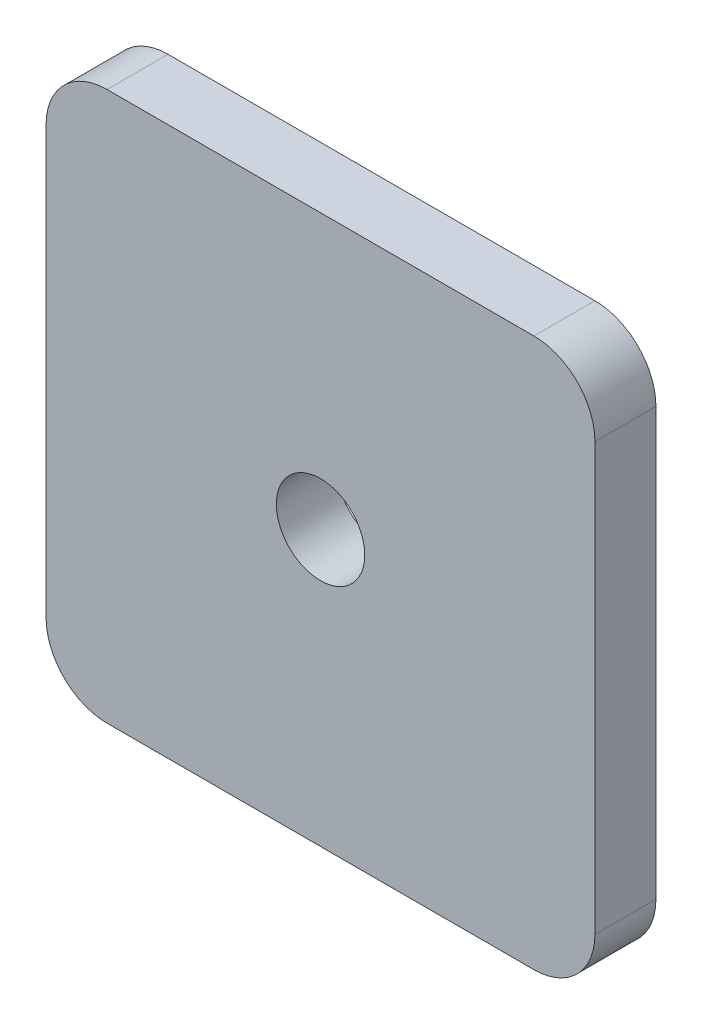
ISO-10303-21;
HEADER;
FILE_DESCRIPTION(('STEP AP214'),'2;1');
FILE_NAME('part.step','',(''),(''),'','','');
FILE_SCHEMA(('AUTOMOTIVE_DESIGN { 1 0 10303 214 1 1 1 1 }'));
ENDSEC;
DATA;
#1=APPLICATION_CONTEXT('core data for automotive mechanical design processes');
#2=APPLICATION_PROTOCOL_DEFINITION('international standard','automotive_design',2000,#1);
#3=PRODUCT_CONTEXT('',#1,'mechanical');
#4=PRODUCT('Part','Part','',(#3));
#5=PRODUCT_RELATED_PRODUCT_CATEGORY('part','',(#4));
#6=PRODUCT_DEFINITION_FORMATION('','',#4);
#7=PRODUCT_DEFINITION_CONTEXT('part definition',#1,'design');
#8=PRODUCT_DEFINITION('design','',#6,#7);
#9=PRODUCT_DEFINITION_SHAPE('','',#8);
#10=(LENGTH_UNIT() NAMED_UNIT(*) SI_UNIT(.MILLI.,.METRE.));
#11=(NAMED_UNIT(*) PLANE_ANGLE_UNIT() SI_UNIT($,.RADIAN.));
#12=(NAMED_UNIT(*) SI_UNIT($,.STERADIAN.) SOLID_ANGLE_UNIT());
#13=UNCERTAINTY_MEASURE_WITH_UNIT(LENGTH_MEASURE(1.E-05),#10,'distance_accuracy_value','');
#14=(GEOMETRIC_REPRESENTATION_CONTEXT(3) GLOBAL_UNCERTAINTY_ASSIGNED_CONTEXT((#13)) GLOBAL_UNIT_ASSIGNED_CONTEXT((#10,
#11,#12)) REPRESENTATION_CONTEXT('',''));
#15=CARTESIAN_POINT('',(0.,0.,0.));
#16=DIRECTION('',(0.,0.,1.));
#17=DIRECTION('',(1.,0.,0.));
#18=AXIS2_PLACEMENT_3D('',#15,#16,#17);
#19=CARTESIAN_POINT('',(45.,45.,-10.));
#20=DIRECTION('',(1.,0.,0.));
#21=DIRECTION('',(0.,1.,0.));
#22=AXIS2_PLACEMENT_3D('',#19,#20,#21);
#23=PLANE('',#22);
#24=DIRECTION('',(0.,1.,0.));
#25=VECTOR('',#24,1.);
#26=CARTESIAN_POINT('',(45.,45.,-10.));
#27=LINE('',#26,#25);
#28=CARTESIAN_POINT('',(45.,-35.,-10.));
#29=VERTEX_POINT('',#28);
#30=CARTESIAN_POINT('',(45.,35.,-10.));
#31=VERTEX_POINT('',#30);
#32=EDGE_CURVE('E200',#29,#31,#27,.T.);
#33=ORIENTED_EDGE('',*,*,#32,.T.);
#34=DIRECTION('',(0.,0.,1.));
#35=VECTOR('',#34,1.);
#36=CARTESIAN_POINT('',(45.,35.,-10.));
#37=LINE('',#36,#35);
#38=CARTESIAN_POINT('',(45.,35.,0.));
#39=VERTEX_POINT('',#38);
#40=EDGE_CURVE('E179',#31,#39,#37,.T.);
#41=ORIENTED_EDGE('',*,*,#40,.T.);
#42=DIRECTION('',(0.,1.,0.));
#43=VECTOR('',#42,1.);
#44=CARTESIAN_POINT('',(45.,45.,0.));
#45=LINE('',#44,#43);
#46=CARTESIAN_POINT('',(45.,-35.,0.));
#47=VERTEX_POINT('',#46);
#48=EDGE_CURVE('E116',#47,#39,#45,.T.);
#49=ORIENTED_EDGE('',*,*,#48,.F.);
#50=DIRECTION('',(0.,0.,1.));
#51=VECTOR('',#50,1.);
#52=CARTESIAN_POINT('',(45.,-35.,-10.));
#53=LINE('',#52,#51);
#54=EDGE_CURVE('E176',#47,#29,#53,.F.);
#55=ORIENTED_EDGE('',*,*,#54,.T.);
#56=EDGE_LOOP('',(#33,#41,#49,#55));
#57=FACE_BOUND('',#56,.T.);
#58=ADVANCED_FACE('F44',(#57),#23,.T.);
#59=CARTESIAN_POINT('',(-45.,-45.,-10.));
#60=DIRECTION('',(0.,-1.,0.));
#61=DIRECTION('',(0.,0.,-1.));
#62=AXIS2_PLACEMENT_3D('',#59,#60,#61);
#63=PLANE('',#62);
#64=DIRECTION('',(1.,0.,0.));
#65=VECTOR('',#64,1.);
#66=CARTESIAN_POINT('',(-45.,-45.,-10.));
#67=LINE('',#66,#65);
#68=CARTESIAN_POINT('',(-35.,-45.,-10.));
#69=VERTEX_POINT('',#68);
#70=CARTESIAN_POINT('',(35.,-45.,-10.));
#71=VERTEX_POINT('',#70);
#72=EDGE_CURVE('E140',#69,#71,#67,.T.);
#73=ORIENTED_EDGE('',*,*,#72,.T.);
#74=DIRECTION('',(0.,0.,1.));
#75=VECTOR('',#74,1.);
#76=CARTESIAN_POINT('',(35.,-45.,-10.));
#77=LINE('',#76,#75);
#78=CARTESIAN_POINT('',(35.,-45.,0.));
#79=VERTEX_POINT('',#78);
#80=EDGE_CURVE('E11',#71,#79,#77,.T.);
#81=ORIENTED_EDGE('',*,*,#80,.T.);
#82=DIRECTION('',(1.,0.,0.));
#83=VECTOR('',#82,1.);
#84=CARTESIAN_POINT('',(-45.,-45.,0.));
#85=LINE('',#84,#83);
#86=CARTESIAN_POINT('',(-35.,-45.,0.));
#87=VERTEX_POINT('',#86);
#88=EDGE_CURVE('E150',#87,#79,#85,.T.);
#89=ORIENTED_EDGE('',*,*,#88,.F.);
#90=DIRECTION('',(0.,0.,1.));
#91=VECTOR('',#90,1.);
#92=CARTESIAN_POINT('',(-35.,-45.,-10.));
#93=LINE('',#92,#91);
#94=EDGE_CURVE('E53',#87,#69,#93,.F.);
#95=ORIENTED_EDGE('',*,*,#94,.T.);
#96=EDGE_LOOP('',(#73,#81,#89,#95));
#97=FACE_BOUND('',#96,.T.);
#98=ADVANCED_FACE('F240',(#97),#63,.T.);
#99=CARTESIAN_POINT('',(-45.,45.,-10.));
#100=DIRECTION('',(-1.,0.,0.));
#101=DIRECTION('',(0.,-1.,0.));
#102=AXIS2_PLACEMENT_3D('',#99,#100,#101);
#103=PLANE('',#102);
#104=DIRECTION('',(0.,-1.,0.));
#105=VECTOR('',#104,1.);
#106=CARTESIAN_POINT('',(-45.,45.,0.));
#107=LINE('',#106,#105);
#108=CARTESIAN_POINT('',(-45.,35.,0.));
#109=VERTEX_POINT('',#108);
#110=CARTESIAN_POINT('',(-45.,-35.,0.));
#111=VERTEX_POINT('',#110);
#112=EDGE_CURVE('E134',#109,#111,#107,.T.);
#113=ORIENTED_EDGE('',*,*,#112,.F.);
#114=DIRECTION('',(0.,0.,1.));
#115=VECTOR('',#114,1.);
#116=CARTESIAN_POINT('',(-45.,35.,-10.));
#117=LINE('',#116,#115);
#118=CARTESIAN_POINT('',(-45.,35.,-10.));
#119=VERTEX_POINT('',#118);
#120=EDGE_CURVE('E163',#109,#119,#117,.F.);
#121=ORIENTED_EDGE('',*,*,#120,.T.);
#122=DIRECTION('',(0.,-1.,0.));
#123=VECTOR('',#122,1.);
#124=CARTESIAN_POINT('',(-45.,45.,-10.));
#125=LINE('',#124,#123);
#126=CARTESIAN_POINT('',(-45.,-35.,-10.));
#127=VERTEX_POINT('',#126);
#128=EDGE_CURVE('E147',#119,#127,#125,.T.);
#129=ORIENTED_EDGE('',*,*,#128,.T.);
#130=DIRECTION('',(0.,0.,1.));
#131=VECTOR('',#130,1.);
#132=CARTESIAN_POINT('',(-45.,-35.,-10.));
#133=LINE('',#132,#131);
#134=EDGE_CURVE('E159',#127,#111,#133,.T.);
#135=ORIENTED_EDGE('',*,*,#134,.T.);
#136=EDGE_LOOP('',(#113,#121,#129,#135));
#137=FACE_BOUND('',#136,.T.);
#138=ADVANCED_FACE('F224',(#137),#103,.T.);
#139=CARTESIAN_POINT('',(-45.,45.,-10.));
#140=DIRECTION('',(0.,1.,0.));
#141=DIRECTION('',(0.,0.,1.));
#142=AXIS2_PLACEMENT_3D('',#139,#140,#141);
#143=PLANE('',#142);
#144=DIRECTION('',(-1.,0.,0.));
#145=VECTOR('',#144,1.);
#146=CARTESIAN_POINT('',(-45.,45.,-10.));
#147=LINE('',#146,#145);
#148=CARTESIAN_POINT('',(35.,45.,-10.));
#149=VERTEX_POINT('',#148);
#150=CARTESIAN_POINT('',(-35.,45.,-10.));
#151=VERTEX_POINT('',#150);
#152=EDGE_CURVE('E202',#149,#151,#147,.T.);
#153=ORIENTED_EDGE('',*,*,#152,.T.);
#154=DIRECTION('',(0.,0.,1.));
#155=VECTOR('',#154,1.);
#156=CARTESIAN_POINT('',(-35.,45.,-10.));
#157=LINE('',#156,#155);
#158=CARTESIAN_POINT('',(-35.,45.,0.));
#159=VERTEX_POINT('',#158);
#160=EDGE_CURVE('E132',#151,#159,#157,.T.);
#161=ORIENTED_EDGE('',*,*,#160,.T.);
#162=DIRECTION('',(-1.,0.,0.));
#163=VECTOR('',#162,1.);
#164=CARTESIAN_POINT('',(-45.,45.,0.));
#165=LINE('',#164,#163);
#166=CARTESIAN_POINT('',(35.,45.,0.));
#167=VERTEX_POINT('',#166);
#168=EDGE_CURVE('E114',#167,#159,#165,.T.);
#169=ORIENTED_EDGE('',*,*,#168,.F.);
#170=DIRECTION('',(0.,0.,1.));
#171=VECTOR('',#170,1.);
#172=CARTESIAN_POINT('',(35.,45.,-10.));
#173=LINE('',#172,#171);
#174=EDGE_CURVE('E129',#167,#149,#173,.F.);
#175=ORIENTED_EDGE('',*,*,#174,.T.);
#176=EDGE_LOOP('',(#153,#161,#169,#175));
#177=FACE_BOUND('',#176,.T.);
#178=ADVANCED_FACE('F128',(#177),#143,.T.);
#179=CARTESIAN_POINT('',(0.,0.,-10.));
#180=DIRECTION('',(0.,0.,1.));
#181=DIRECTION('',(1.,0.,0.));
#182=AXIS2_PLACEMENT_3D('',#179,#180,#181);
#183=PLANE('',#182);
#184=CARTESIAN_POINT('',(0.,0.,-10.));
#185=DIRECTION('',(0.,0.,1.));
#186=DIRECTION('',(1.,0.,0.));
#187=AXIS2_PLACEMENT_3D('',#184,#185,#186);
#188=CIRCLE('',#187,7.25);
#189=CARTESIAN_POINT('',(7.24999999999997,0.,-10.));
#190=VERTEX_POINT('',#189);
#191=EDGE_CURVE('E217',#190,#190,#188,.T.);
#192=ORIENTED_EDGE('',*,*,#191,.T.);
#193=EDGE_LOOP('',(#192));
#194=FACE_BOUND('',#193,.T.);
#195=ORIENTED_EDGE('',*,*,#128,.F.);
#196=CARTESIAN_POINT('',(-35.,35.,-10.));
#197=DIRECTION('',(0.,0.,1.));
#198=DIRECTION('',(1.,0.,0.));
#199=AXIS2_PLACEMENT_3D('',#196,#197,#198);
#200=CIRCLE('',#199,10.);
#201=EDGE_CURVE('E173',#119,#151,#200,.F.);
#202=ORIENTED_EDGE('',*,*,#201,.T.);
#203=ORIENTED_EDGE('',*,*,#152,.F.);
#204=CARTESIAN_POINT('',(35.,35.,-10.));
#205=DIRECTION('',(0.,0.,1.));
#206=DIRECTION('',(1.,0.,0.));
#207=AXIS2_PLACEMENT_3D('',#204,#205,#206);
#208=CIRCLE('',#207,10.);
#209=EDGE_CURVE('E138',#149,#31,#208,.F.);
#210=ORIENTED_EDGE('',*,*,#209,.T.);
#211=ORIENTED_EDGE('',*,*,#32,.F.);
#212=CARTESIAN_POINT('',(35.,-35.,-10.));
#213=DIRECTION('',(0.,0.,1.));
#214=DIRECTION('',(1.,0.,0.));
#215=AXIS2_PLACEMENT_3D('',#212,#213,#214);
#216=CIRCLE('',#215,10.);
#217=EDGE_CURVE('E60',#29,#71,#216,.F.);
#218=ORIENTED_EDGE('',*,*,#217,.T.);
#219=ORIENTED_EDGE('',*,*,#72,.F.);
#220=CARTESIAN_POINT('',(-35.,-35.,-10.));
#221=DIRECTION('',(0.,0.,1.));
#222=DIRECTION('',(1.,0.,0.));
#223=AXIS2_PLACEMENT_3D('',#220,#221,#222);
#224=CIRCLE('',#223,10.);
#225=EDGE_CURVE('E166',#69,#127,#224,.F.);
#226=ORIENTED_EDGE('',*,*,#225,.T.);
#227=EDGE_LOOP('',(#195,#202,#203,#210,#211,#218,#219,#226));
#228=FACE_BOUND('',#227,.T.);
#229=ADVANCED_FACE('F230',(#194,#228),#183,.F.);
#230=CARTESIAN_POINT('',(0.,0.,0.));
#231=DIRECTION('',(0.,0.,1.));
#232=DIRECTION('',(1.,0.,0.));
#233=AXIS2_PLACEMENT_3D('',#230,#231,#232);
#234=PLANE('',#233);
#235=CARTESIAN_POINT('',(0.,0.,0.));
#236=DIRECTION('',(0.,0.,1.));
#237=DIRECTION('',(1.,0.,0.));
#238=AXIS2_PLACEMENT_3D('',#235,#236,#237);
#239=CIRCLE('',#238,7.25);
#240=CARTESIAN_POINT('',(7.24999999999997,0.,0.));
#241=VERTEX_POINT('',#240);
#242=EDGE_CURVE('E210',#241,#241,#239,.T.);
#243=ORIENTED_EDGE('',*,*,#242,.F.);
#244=EDGE_LOOP('',(#243));
#245=FACE_BOUND('',#244,.T.);
#246=ORIENTED_EDGE('',*,*,#168,.T.);
#247=CARTESIAN_POINT('',(-35.,35.,0.));
#248=DIRECTION('',(0.,0.,1.));
#249=DIRECTION('',(1.,0.,0.));
#250=AXIS2_PLACEMENT_3D('',#247,#248,#249);
#251=CIRCLE('',#250,10.);
#252=EDGE_CURVE('E122',#159,#109,#251,.T.);
#253=ORIENTED_EDGE('',*,*,#252,.T.);
#254=ORIENTED_EDGE('',*,*,#112,.T.);
#255=CARTESIAN_POINT('',(-35.,-35.,0.));
#256=DIRECTION('',(0.,0.,1.));
#257=DIRECTION('',(1.,0.,0.));
#258=AXIS2_PLACEMENT_3D('',#255,#256,#257);
#259=CIRCLE('',#258,10.);
#260=EDGE_CURVE('E145',#111,#87,#259,.T.);
#261=ORIENTED_EDGE('',*,*,#260,.T.);
#262=ORIENTED_EDGE('',*,*,#88,.T.);
#263=CARTESIAN_POINT('',(35.,-35.,0.));
#264=DIRECTION('',(0.,0.,1.));
#265=DIRECTION('',(1.,0.,0.));
#266=AXIS2_PLACEMENT_3D('',#263,#264,#265);
#267=CIRCLE('',#266,10.);
#268=EDGE_CURVE('E123',#79,#47,#267,.T.);
#269=ORIENTED_EDGE('',*,*,#268,.T.);
#270=ORIENTED_EDGE('',*,*,#48,.T.);
#271=CARTESIAN_POINT('',(35.,35.,0.));
#272=DIRECTION('',(0.,0.,1.));
#273=DIRECTION('',(1.,0.,0.));
#274=AXIS2_PLACEMENT_3D('',#271,#272,#273);
#275=CIRCLE('',#274,10.);
#276=EDGE_CURVE('E111',#39,#167,#275,.T.);
#277=ORIENTED_EDGE('',*,*,#276,.T.);
#278=EDGE_LOOP('',(#246,#253,#254,#261,#262,#269,#270,#277));
#279=FACE_BOUND('',#278,.T.);
#280=ADVANCED_FACE('F113',(#245,#279),#234,.T.);
#281=CARTESIAN_POINT('',(0.,0.,-10.));
#282=DIRECTION('',(0.,0.,1.));
#283=DIRECTION('',(1.,0.,0.));
#284=AXIS2_PLACEMENT_3D('',#281,#282,#283);
#285=CYLINDRICAL_SURFACE('',#284,7.25);
#286=ORIENTED_EDGE('',*,*,#191,.F.);
#287=EDGE_LOOP('',(#286));
#288=FACE_BOUND('',#287,.T.);
#289=ORIENTED_EDGE('',*,*,#242,.T.);
#290=EDGE_LOOP('',(#289));
#291=FACE_BOUND('',#290,.T.);
#292=ADVANCED_FACE('F251',(#288,#291),#285,.F.);
#293=CARTESIAN_POINT('',(-35.,35.,-10.));
#294=DIRECTION('',(0.,0.,1.));
#295=DIRECTION('',(1.,0.,0.));
#296=AXIS2_PLACEMENT_3D('',#293,#294,#295);
#297=CYLINDRICAL_SURFACE('',#296,10.);
#298=ORIENTED_EDGE('',*,*,#201,.F.);
#299=ORIENTED_EDGE('',*,*,#120,.F.);
#300=ORIENTED_EDGE('',*,*,#252,.F.);
#301=ORIENTED_EDGE('',*,*,#160,.F.);
#302=EDGE_LOOP('',(#298,#299,#300,#301));
#303=FACE_BOUND('',#302,.T.);
#304=ADVANCED_FACE('F229',(#303),#297,.T.);
#305=CARTESIAN_POINT('',(35.,35.,-10.));
#306=DIRECTION('',(0.,0.,1.));
#307=DIRECTION('',(1.,0.,0.));
#308=AXIS2_PLACEMENT_3D('',#305,#306,#307);
#309=CYLINDRICAL_SURFACE('',#308,10.);
#310=ORIENTED_EDGE('',*,*,#209,.F.);
#311=ORIENTED_EDGE('',*,*,#174,.F.);
#312=ORIENTED_EDGE('',*,*,#276,.F.);
#313=ORIENTED_EDGE('',*,*,#40,.F.);
#314=EDGE_LOOP('',(#310,#311,#312,#313));
#315=FACE_BOUND('',#314,.T.);
#316=ADVANCED_FACE('F137',(#315),#309,.T.);
#317=CARTESIAN_POINT('',(35.,-35.,-10.));
#318=DIRECTION('',(0.,0.,1.));
#319=DIRECTION('',(1.,0.,0.));
#320=AXIS2_PLACEMENT_3D('',#317,#318,#319);
#321=CYLINDRICAL_SURFACE('',#320,10.);
#322=ORIENTED_EDGE('',*,*,#217,.F.);
#323=ORIENTED_EDGE('',*,*,#54,.F.);
#324=ORIENTED_EDGE('',*,*,#268,.F.);
#325=ORIENTED_EDGE('',*,*,#80,.F.);
#326=EDGE_LOOP('',(#322,#323,#324,#325));
#327=FACE_BOUND('',#326,.T.);
#328=ADVANCED_FACE('F234',(#327),#321,.T.);
#329=CARTESIAN_POINT('',(-35.,-35.,-10.));
#330=DIRECTION('',(0.,0.,1.));
#331=DIRECTION('',(1.,0.,0.));
#332=AXIS2_PLACEMENT_3D('',#329,#330,#331);
#333=CYLINDRICAL_SURFACE('',#332,10.);
#334=ORIENTED_EDGE('',*,*,#225,.F.);
#335=ORIENTED_EDGE('',*,*,#94,.F.);
#336=ORIENTED_EDGE('',*,*,#260,.F.);
#337=ORIENTED_EDGE('',*,*,#134,.F.);
#338=EDGE_LOOP('',(#334,#335,#336,#337));
#339=FACE_BOUND('',#338,.T.);
#340=ADVANCED_FACE('F46',(#339),#333,.T.);
#341=CLOSED_SHELL('',(#58,#98,#138,#178,#229,#280,#292,#304,#316,#328,#340));
#342=MANIFOLD_SOLID_BREP('B2',#341);
#343=ADVANCED_BREP_SHAPE_REPRESENTATION('',(#18,#342),#14);
#344=SHAPE_DEFINITION_REPRESENTATION(#9,#343);
ENDSEC;
END-ISO-10303-21;
